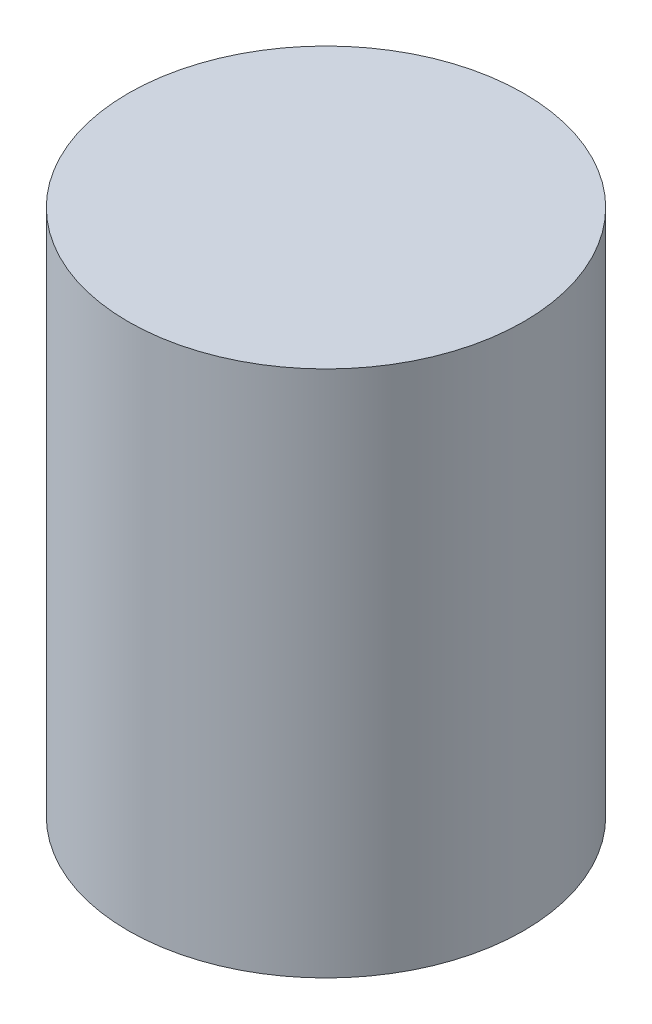
ISO-10303-21;
HEADER;
FILE_DESCRIPTION(('STEP AP214'),'2;1');
FILE_NAME('part.step','',(''),(''),'','','');
FILE_SCHEMA(('AUTOMOTIVE_DESIGN { 1 0 10303 214 1 1 1 1 }'));
ENDSEC;
DATA;
#1=APPLICATION_CONTEXT('core data for automotive mechanical design processes');
#2=APPLICATION_PROTOCOL_DEFINITION('international standard','automotive_design',2000,#1);
#3=PRODUCT_CONTEXT('',#1,'mechanical');
#4=PRODUCT('Part','Part','',(#3));
#5=PRODUCT_RELATED_PRODUCT_CATEGORY('part','',(#4));
#6=PRODUCT_DEFINITION_FORMATION('','',#4);
#7=PRODUCT_DEFINITION_CONTEXT('part definition',#1,'design');
#8=PRODUCT_DEFINITION('design','',#6,#7);
#9=PRODUCT_DEFINITION_SHAPE('','',#8);
#10=(LENGTH_UNIT() NAMED_UNIT(*) SI_UNIT(.MILLI.,.METRE.));
#11=(NAMED_UNIT(*) PLANE_ANGLE_UNIT() SI_UNIT($,.RADIAN.));
#12=(NAMED_UNIT(*) SI_UNIT($,.STERADIAN.) SOLID_ANGLE_UNIT());
#13=UNCERTAINTY_MEASURE_WITH_UNIT(LENGTH_MEASURE(1.E-05),#10,'distance_accuracy_value','');
#14=(GEOMETRIC_REPRESENTATION_CONTEXT(3) GLOBAL_UNCERTAINTY_ASSIGNED_CONTEXT((#13)) GLOBAL_UNIT_ASSIGNED_CONTEXT((#10,
#11,#12)) REPRESENTATION_CONTEXT('',''));
#15=CARTESIAN_POINT('',(0.,0.,0.));
#16=DIRECTION('',(0.,0.,1.));
#17=DIRECTION('',(1.,0.,0.));
#18=AXIS2_PLACEMENT_3D('',#15,#16,#17);
#19=CARTESIAN_POINT('',(0.,80.,0.));
#20=DIRECTION('',(0.,-1.,0.));
#21=DIRECTION('',(0.,0.,-1.));
#22=AXIS2_PLACEMENT_3D('',#19,#20,#21);
#23=CYLINDRICAL_SURFACE('',#22,30.);
#24=CARTESIAN_POINT('',(0.,80.,0.));
#25=DIRECTION('',(0.,1.,0.));
#26=DIRECTION('',(0.,0.,1.));
#27=AXIS2_PLACEMENT_3D('',#24,#25,#26);
#28=CIRCLE('',#27,30.);
#29=CARTESIAN_POINT('',(0.,80.,30.));
#30=VERTEX_POINT('',#29);
#31=EDGE_CURVE('E10',#30,#30,#28,.T.);
#32=ORIENTED_EDGE('',*,*,#31,.F.);
#33=EDGE_LOOP('',(#32));
#34=FACE_BOUND('',#33,.T.);
#35=CARTESIAN_POINT('',(0.,0.,0.));
#36=DIRECTION('',(0.,1.,0.));
#37=DIRECTION('',(0.,0.,1.));
#38=AXIS2_PLACEMENT_3D('',#35,#36,#37);
#39=CIRCLE('',#38,30.);
#40=CARTESIAN_POINT('',(0.,0.,30.));
#41=VERTEX_POINT('',#40);
#42=EDGE_CURVE('E36',#41,#41,#39,.T.);
#43=ORIENTED_EDGE('',*,*,#42,.T.);
#44=EDGE_LOOP('',(#43));
#45=FACE_BOUND('',#44,.T.);
#46=ADVANCED_FACE('F33',(#34,#45),#23,.T.);
#47=CARTESIAN_POINT('',(0.,80.,0.));
#48=DIRECTION('',(0.,1.,0.));
#49=DIRECTION('',(0.,0.,1.));
#50=AXIS2_PLACEMENT_3D('',#47,#48,#49);
#51=PLANE('',#50);
#52=ORIENTED_EDGE('',*,*,#31,.T.);
#53=EDGE_LOOP('',(#52));
#54=FACE_BOUND('',#53,.T.);
#55=ADVANCED_FACE('F48',(#54),#51,.T.);
#56=CARTESIAN_POINT('',(0.,0.,0.));
#57=DIRECTION('',(0.,1.,0.));
#58=DIRECTION('',(0.,0.,1.));
#59=AXIS2_PLACEMENT_3D('',#56,#57,#58);
#60=PLANE('',#59);
#61=ORIENTED_EDGE('',*,*,#42,.F.);
#62=EDGE_LOOP('',(#61));
#63=FACE_BOUND('',#62,.T.);
#64=ADVANCED_FACE('F46',(#63),#60,.F.);
#65=CLOSED_SHELL('',(#46,#55,#64));
#66=MANIFOLD_SOLID_BREP('B2',#65);
#67=ADVANCED_BREP_SHAPE_REPRESENTATION('',(#18,#66),#14);
#68=SHAPE_DEFINITION_REPRESENTATION(#9,#67);
ENDSEC;
END-ISO-10303-21;
